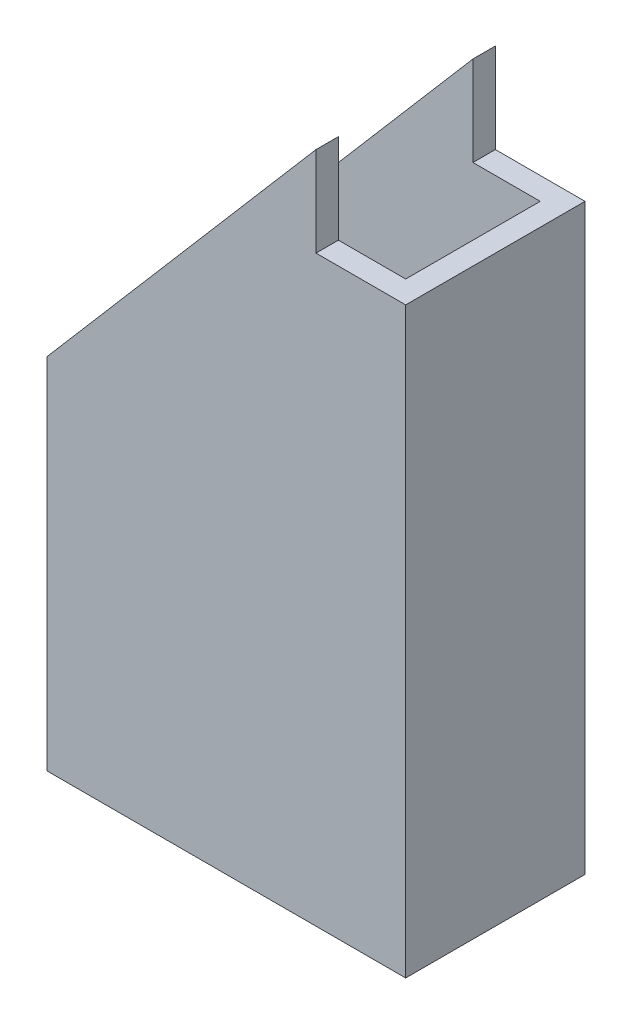
ISO-10303-21;
HEADER;
FILE_DESCRIPTION(('STEP AP214'),'2;1');
FILE_NAME('part.step','',(''),(''),'','','');
FILE_SCHEMA(('AUTOMOTIVE_DESIGN { 1 0 10303 214 1 1 1 1 }'));
ENDSEC;
DATA;
#1=APPLICATION_CONTEXT('core data for automotive mechanical design processes');
#2=APPLICATION_PROTOCOL_DEFINITION('international standard','automotive_design',2000,#1);
#3=PRODUCT_CONTEXT('',#1,'mechanical');
#4=PRODUCT('Part','Part','',(#3));
#5=PRODUCT_RELATED_PRODUCT_CATEGORY('part','',(#4));
#6=PRODUCT_DEFINITION_FORMATION('','',#4);
#7=PRODUCT_DEFINITION_CONTEXT('part definition',#1,'design');
#8=PRODUCT_DEFINITION('design','',#6,#7);
#9=PRODUCT_DEFINITION_SHAPE('','',#8);
#10=(LENGTH_UNIT() NAMED_UNIT(*) SI_UNIT(.MILLI.,.METRE.));
#11=(NAMED_UNIT(*) PLANE_ANGLE_UNIT() SI_UNIT($,.RADIAN.));
#12=(NAMED_UNIT(*) SI_UNIT($,.STERADIAN.) SOLID_ANGLE_UNIT());
#13=UNCERTAINTY_MEASURE_WITH_UNIT(LENGTH_MEASURE(1.E-05),#10,'distance_accuracy_value','');
#14=(GEOMETRIC_REPRESENTATION_CONTEXT(3) GLOBAL_UNCERTAINTY_ASSIGNED_CONTEXT((#13)) GLOBAL_UNIT_ASSIGNED_CONTEXT((#10,
#11,#12)) REPRESENTATION_CONTEXT('',''));
#15=CARTESIAN_POINT('',(0.,0.,0.));
#16=DIRECTION('',(0.,0.,1.));
#17=DIRECTION('',(1.,0.,0.));
#18=AXIS2_PLACEMENT_3D('',#15,#16,#17);
#19=CARTESIAN_POINT('',(12.7,47.625,12.7));
#20=DIRECTION('',(-1.,0.,0.));
#21=DIRECTION('',(0.,-1.,0.));
#22=AXIS2_PLACEMENT_3D('',#19,#20,#21);
#23=PLANE('',#22);
#24=DIRECTION('',(0.,0.,-1.));
#25=VECTOR('',#24,1.);
#26=CARTESIAN_POINT('',(12.7,34.925,12.7));
#27=LINE('',#26,#25);
#28=CARTESIAN_POINT('',(12.7,34.925,12.7));
#29=VERTEX_POINT('',#28);
#30=CARTESIAN_POINT('',(12.7,34.925,9.525));
#31=VERTEX_POINT('',#30);
#32=EDGE_CURVE('E196',#29,#31,#27,.T.);
#33=ORIENTED_EDGE('',*,*,#32,.T.);
#34=DIRECTION('',(0.,1.,0.));
#35=VECTOR('',#34,1.);
#36=CARTESIAN_POINT('',(12.7,47.625,9.525));
#37=LINE('',#36,#35);
#38=CARTESIAN_POINT('',(12.7,47.625,9.525));
#39=VERTEX_POINT('',#38);
#40=EDGE_CURVE('E154',#31,#39,#37,.T.);
#41=ORIENTED_EDGE('',*,*,#40,.T.);
#42=DIRECTION('',(0.,0.,-1.));
#43=VECTOR('',#42,1.);
#44=CARTESIAN_POINT('',(12.7,47.625,12.7));
#45=LINE('',#44,#43);
#46=CARTESIAN_POINT('',(12.7,47.625,12.7));
#47=VERTEX_POINT('',#46);
#48=EDGE_CURVE('E192',#47,#39,#45,.T.);
#49=ORIENTED_EDGE('',*,*,#48,.F.);
#50=DIRECTION('',(0.,1.,0.));
#51=VECTOR('',#50,1.);
#52=CARTESIAN_POINT('',(12.7,47.625,12.7));
#53=LINE('',#52,#51);
#54=EDGE_CURVE('E171',#29,#47,#53,.T.);
#55=ORIENTED_EDGE('',*,*,#54,.F.);
#56=EDGE_LOOP('',(#33,#41,#49,#55));
#57=FACE_BOUND('',#56,.T.);
#58=ADVANCED_FACE('F33',(#57),#23,.F.);
#59=CARTESIAN_POINT('',(-25.4,-47.625,12.7));
#60=DIRECTION('',(1.,0.,0.));
#61=DIRECTION('',(0.,0.,-1.));
#62=AXIS2_PLACEMENT_3D('',#59,#60,#61);
#63=PLANE('',#62);
#64=DIRECTION('',(0.,-1.,0.));
#65=VECTOR('',#64,1.);
#66=CARTESIAN_POINT('',(-25.4,-47.625,-12.7));
#67=LINE('',#66,#65);
#68=CARTESIAN_POINT('',(-25.4,3.17499999999999,-12.7));
#69=VERTEX_POINT('',#68);
#70=CARTESIAN_POINT('',(-25.4,-47.625,-12.7));
#71=VERTEX_POINT('',#70);
#72=EDGE_CURVE('E160',#69,#71,#67,.T.);
#73=ORIENTED_EDGE('',*,*,#72,.T.);
#74=DIRECTION('',(0.,0.,-1.));
#75=VECTOR('',#74,1.);
#76=CARTESIAN_POINT('',(-25.4,-47.625,12.7));
#77=LINE('',#76,#75);
#78=CARTESIAN_POINT('',(-25.4,-47.625,12.7));
#79=VERTEX_POINT('',#78);
#80=EDGE_CURVE('E205',#79,#71,#77,.T.);
#81=ORIENTED_EDGE('',*,*,#80,.F.);
#82=DIRECTION('',(0.,-1.,0.));
#83=VECTOR('',#82,1.);
#84=CARTESIAN_POINT('',(-25.4,-47.625,12.7));
#85=LINE('',#84,#83);
#86=CARTESIAN_POINT('',(-25.4,3.17499999999999,12.7));
#87=VERTEX_POINT('',#86);
#88=EDGE_CURVE('E161',#87,#79,#85,.T.);
#89=ORIENTED_EDGE('',*,*,#88,.F.);
#90=DIRECTION('',(0.,0.,-1.));
#91=VECTOR('',#90,1.);
#92=CARTESIAN_POINT('',(-25.4,3.17499999999999,12.7));
#93=LINE('',#92,#91);
#94=EDGE_CURVE('E175',#87,#69,#93,.T.);
#95=ORIENTED_EDGE('',*,*,#94,.T.);
#96=EDGE_LOOP('',(#73,#81,#89,#95));
#97=FACE_BOUND('',#96,.T.);
#98=ADVANCED_FACE('F35',(#97),#63,.F.);
#99=CARTESIAN_POINT('',(-25.4,-47.625,12.7));
#100=DIRECTION('',(0.,1.,0.));
#101=DIRECTION('',(0.,0.,1.));
#102=AXIS2_PLACEMENT_3D('',#99,#100,#101);
#103=PLANE('',#102);
#104=DIRECTION('',(1.,0.,0.));
#105=VECTOR('',#104,1.);
#106=CARTESIAN_POINT('',(-22.225,-47.625,-9.525));
#107=LINE('',#106,#105);
#108=CARTESIAN_POINT('',(-22.225,-47.625,-9.525));
#109=VERTEX_POINT('',#108);
#110=CARTESIAN_POINT('',(22.225,-47.625,-9.525));
#111=VERTEX_POINT('',#110);
#112=EDGE_CURVE('E135',#109,#111,#107,.T.);
#113=ORIENTED_EDGE('',*,*,#112,.F.);
#114=DIRECTION('',(0.,0.,-1.));
#115=VECTOR('',#114,1.);
#116=CARTESIAN_POINT('',(-22.225,-47.625,9.525));
#117=LINE('',#116,#115);
#118=CARTESIAN_POINT('',(-22.225,-47.625,9.525));
#119=VERTEX_POINT('',#118);
#120=EDGE_CURVE('E48',#119,#109,#117,.T.);
#121=ORIENTED_EDGE('',*,*,#120,.F.);
#122=DIRECTION('',(-1.,0.,0.));
#123=VECTOR('',#122,1.);
#124=CARTESIAN_POINT('',(22.225,-47.625,9.525));
#125=LINE('',#124,#123);
#126=CARTESIAN_POINT('',(22.225,-47.625,9.525));
#127=VERTEX_POINT('',#126);
#128=EDGE_CURVE('E142',#127,#119,#125,.T.);
#129=ORIENTED_EDGE('',*,*,#128,.F.);
#130=DIRECTION('',(0.,0.,1.));
#131=VECTOR('',#130,1.);
#132=CARTESIAN_POINT('',(22.225,-47.625,-9.525));
#133=LINE('',#132,#131);
#134=EDGE_CURVE('E128',#111,#127,#133,.T.);
#135=ORIENTED_EDGE('',*,*,#134,.F.);
#136=EDGE_LOOP('',(#113,#121,#129,#135));
#137=FACE_BOUND('',#136,.T.);
#138=DIRECTION('',(1.,0.,0.));
#139=VECTOR('',#138,1.);
#140=CARTESIAN_POINT('',(-25.4,-47.625,-12.7));
#141=LINE('',#140,#139);
#142=CARTESIAN_POINT('',(25.4,-47.625,-12.7));
#143=VERTEX_POINT('',#142);
#144=EDGE_CURVE('E178',#71,#143,#141,.T.);
#145=ORIENTED_EDGE('',*,*,#144,.T.);
#146=DIRECTION('',(0.,0.,-1.));
#147=VECTOR('',#146,1.);
#148=CARTESIAN_POINT('',(25.4,-47.625,12.7));
#149=LINE('',#148,#147);
#150=CARTESIAN_POINT('',(25.4,-47.625,12.7));
#151=VERTEX_POINT('',#150);
#152=EDGE_CURVE('E202',#151,#143,#149,.T.);
#153=ORIENTED_EDGE('',*,*,#152,.F.);
#154=DIRECTION('',(1.,0.,0.));
#155=VECTOR('',#154,1.);
#156=CARTESIAN_POINT('',(-25.4,-47.625,12.7));
#157=LINE('',#156,#155);
#158=EDGE_CURVE('E164',#79,#151,#157,.T.);
#159=ORIENTED_EDGE('',*,*,#158,.F.);
#160=ORIENTED_EDGE('',*,*,#80,.T.);
#161=EDGE_LOOP('',(#145,#153,#159,#160));
#162=FACE_BOUND('',#161,.T.);
#163=ADVANCED_FACE('F139',(#137,#162),#103,.F.);
#164=CARTESIAN_POINT('',(25.4,-47.625,12.7));
#165=DIRECTION('',(-1.,0.,0.));
#166=DIRECTION('',(0.,0.,1.));
#167=AXIS2_PLACEMENT_3D('',#164,#165,#166);
#168=PLANE('',#167);
#169=DIRECTION('',(0.,1.,0.));
#170=VECTOR('',#169,1.);
#171=CARTESIAN_POINT('',(25.4,-47.625,-12.7));
#172=LINE('',#171,#170);
#173=CARTESIAN_POINT('',(25.4,34.925,-12.7));
#174=VERTEX_POINT('',#173);
#175=EDGE_CURVE('E180',#143,#174,#172,.T.);
#176=ORIENTED_EDGE('',*,*,#175,.T.);
#177=DIRECTION('',(0.,0.,-1.));
#178=VECTOR('',#177,1.);
#179=CARTESIAN_POINT('',(25.4,34.925,12.7));
#180=LINE('',#179,#178);
#181=CARTESIAN_POINT('',(25.4,34.925,12.7));
#182=VERTEX_POINT('',#181);
#183=EDGE_CURVE('E199',#182,#174,#180,.T.);
#184=ORIENTED_EDGE('',*,*,#183,.F.);
#185=DIRECTION('',(0.,1.,0.));
#186=VECTOR('',#185,1.);
#187=CARTESIAN_POINT('',(25.4,-47.625,12.7));
#188=LINE('',#187,#186);
#189=EDGE_CURVE('E167',#151,#182,#188,.T.);
#190=ORIENTED_EDGE('',*,*,#189,.F.);
#191=ORIENTED_EDGE('',*,*,#152,.T.);
#192=EDGE_LOOP('',(#176,#184,#190,#191));
#193=FACE_BOUND('',#192,.T.);
#194=ADVANCED_FACE('F259',(#193),#168,.F.);
#195=CARTESIAN_POINT('',(12.7,34.925,12.7));
#196=DIRECTION('',(0.,-1.,0.));
#197=DIRECTION('',(0.,0.,-1.));
#198=AXIS2_PLACEMENT_3D('',#195,#196,#197);
#199=PLANE('',#198);
#200=DIRECTION('',(0.,0.,1.));
#201=VECTOR('',#200,1.);
#202=CARTESIAN_POINT('',(22.225,34.925,12.7));
#203=LINE('',#202,#201);
#204=CARTESIAN_POINT('',(22.225,34.925,-9.525));
#205=VERTEX_POINT('',#204);
#206=CARTESIAN_POINT('',(22.225,34.925,9.525));
#207=VERTEX_POINT('',#206);
#208=EDGE_CURVE('E11',#205,#207,#203,.T.);
#209=ORIENTED_EDGE('',*,*,#208,.T.);
#210=DIRECTION('',(-1.,0.,0.));
#211=VECTOR('',#210,1.);
#212=CARTESIAN_POINT('',(12.7,34.925,9.525));
#213=LINE('',#212,#211);
#214=EDGE_CURVE('E157',#207,#31,#213,.T.);
#215=ORIENTED_EDGE('',*,*,#214,.T.);
#216=ORIENTED_EDGE('',*,*,#32,.F.);
#217=DIRECTION('',(-1.,0.,0.));
#218=VECTOR('',#217,1.);
#219=CARTESIAN_POINT('',(12.7,34.925,12.7));
#220=LINE('',#219,#218);
#221=EDGE_CURVE('E169',#182,#29,#220,.T.);
#222=ORIENTED_EDGE('',*,*,#221,.F.);
#223=ORIENTED_EDGE('',*,*,#183,.T.);
#224=DIRECTION('',(-1.,0.,0.));
#225=VECTOR('',#224,1.);
#226=CARTESIAN_POINT('',(12.7,34.925,-12.7));
#227=LINE('',#226,#225);
#228=CARTESIAN_POINT('',(12.7,34.925,-12.7));
#229=VERTEX_POINT('',#228);
#230=EDGE_CURVE('E182',#174,#229,#227,.T.);
#231=ORIENTED_EDGE('',*,*,#230,.T.);
#232=CARTESIAN_POINT('',(12.7,34.925,-9.525));
#233=VERTEX_POINT('',#232);
#234=EDGE_CURVE('E195',#233,#229,#27,.T.);
#235=ORIENTED_EDGE('',*,*,#234,.F.);
#236=DIRECTION('',(1.,0.,0.));
#237=VECTOR('',#236,1.);
#238=CARTESIAN_POINT('',(12.7,34.925,-9.525));
#239=LINE('',#238,#237);
#240=EDGE_CURVE('E152',#233,#205,#239,.T.);
#241=ORIENTED_EDGE('',*,*,#240,.T.);
#242=EDGE_LOOP('',(#209,#215,#216,#222,#223,#231,#235,#241));
#243=FACE_BOUND('',#242,.T.);
#244=ADVANCED_FACE('F225',(#243),#199,.F.);
#245=CARTESIAN_POINT('',(12.7,47.625,-9.525));
#246=VERTEX_POINT('',#245);
#247=CARTESIAN_POINT('',(12.7,47.625,-12.7));
#248=VERTEX_POINT('',#247);
#249=EDGE_CURVE('E191',#246,#248,#45,.T.);
#250=ORIENTED_EDGE('',*,*,#249,.F.);
#251=DIRECTION('',(0.,-1.,0.));
#252=VECTOR('',#251,1.);
#253=CARTESIAN_POINT('',(12.7,47.625,-9.525));
#254=LINE('',#253,#252);
#255=EDGE_CURVE('E56',#246,#233,#254,.T.);
#256=ORIENTED_EDGE('',*,*,#255,.T.);
#257=ORIENTED_EDGE('',*,*,#234,.T.);
#258=DIRECTION('',(0.,1.,0.));
#259=VECTOR('',#258,1.);
#260=CARTESIAN_POINT('',(12.7,47.625,-12.7));
#261=LINE('',#260,#259);
#262=EDGE_CURVE('E185',#229,#248,#261,.T.);
#263=ORIENTED_EDGE('',*,*,#262,.T.);
#264=EDGE_LOOP('',(#250,#256,#257,#263));
#265=FACE_BOUND('',#264,.T.);
#266=ADVANCED_FACE('F229',(#265),#23,.F.);
#267=CARTESIAN_POINT('',(-25.4,3.17499999999999,12.7));
#268=DIRECTION('',(0.759256602365297,-0.650791373455968,0.));
#269=DIRECTION('',(0.650791373455968,0.759256602365297,0.));
#270=AXIS2_PLACEMENT_3D('',#267,#268,#269);
#271=PLANE('',#270);
#272=ORIENTED_EDGE('',*,*,#48,.T.);
#273=DIRECTION('',(-0.650791373455968,-0.759256602365297,0.));
#274=VECTOR('',#273,1.);
#275=CARTESIAN_POINT('',(-25.4,3.17499999999999,9.525));
#276=LINE('',#275,#274);
#277=CARTESIAN_POINT('',(-22.225,6.87916666666667,9.525));
#278=VERTEX_POINT('',#277);
#279=EDGE_CURVE('E41',#39,#278,#276,.T.);
#280=ORIENTED_EDGE('',*,*,#279,.T.);
#281=DIRECTION('',(0.,0.,-1.));
#282=VECTOR('',#281,1.);
#283=CARTESIAN_POINT('',(-22.225,6.87916666666666,12.7));
#284=LINE('',#283,#282);
#285=CARTESIAN_POINT('',(-22.225,6.87916666666667,-9.525));
#286=VERTEX_POINT('',#285);
#287=EDGE_CURVE('E210',#278,#286,#284,.T.);
#288=ORIENTED_EDGE('',*,*,#287,.T.);
#289=DIRECTION('',(0.650791373455968,0.759256602365297,0.));
#290=VECTOR('',#289,1.);
#291=CARTESIAN_POINT('',(-25.4,3.17499999999999,-9.525));
#292=LINE('',#291,#290);
#293=EDGE_CURVE('E208',#286,#246,#292,.T.);
#294=ORIENTED_EDGE('',*,*,#293,.T.);
#295=ORIENTED_EDGE('',*,*,#249,.T.);
#296=DIRECTION('',(-0.650791373455968,-0.759256602365297,0.));
#297=VECTOR('',#296,1.);
#298=CARTESIAN_POINT('',(-25.4,3.17499999999999,-12.7));
#299=LINE('',#298,#297);
#300=EDGE_CURVE('E165',#248,#69,#299,.T.);
#301=ORIENTED_EDGE('',*,*,#300,.T.);
#302=ORIENTED_EDGE('',*,*,#94,.F.);
#303=DIRECTION('',(-0.650791373455968,-0.759256602365297,0.));
#304=VECTOR('',#303,1.);
#305=CARTESIAN_POINT('',(-25.4,3.17499999999999,12.7));
#306=LINE('',#305,#304);
#307=EDGE_CURVE('E173',#47,#87,#306,.T.);
#308=ORIENTED_EDGE('',*,*,#307,.F.);
#309=EDGE_LOOP('',(#272,#280,#288,#294,#295,#301,#302,#308));
#310=FACE_BOUND('',#309,.T.);
#311=ADVANCED_FACE('F214',(#310),#271,.F.);
#312=CARTESIAN_POINT('',(0.,0.,12.7));
#313=DIRECTION('',(0.,0.,-1.));
#314=DIRECTION('',(-1.,0.,0.));
#315=AXIS2_PLACEMENT_3D('',#312,#313,#314);
#316=PLANE('',#315);
#317=ORIENTED_EDGE('',*,*,#88,.T.);
#318=ORIENTED_EDGE('',*,*,#158,.T.);
#319=ORIENTED_EDGE('',*,*,#189,.T.);
#320=ORIENTED_EDGE('',*,*,#221,.T.);
#321=ORIENTED_EDGE('',*,*,#54,.T.);
#322=ORIENTED_EDGE('',*,*,#307,.T.);
#323=EDGE_LOOP('',(#317,#318,#319,#320,#321,#322));
#324=FACE_BOUND('',#323,.T.);
#325=ADVANCED_FACE('F258',(#324),#316,.F.);
#326=CARTESIAN_POINT('',(0.,0.,-12.7));
#327=DIRECTION('',(0.,0.,-1.));
#328=DIRECTION('',(-1.,0.,0.));
#329=AXIS2_PLACEMENT_3D('',#326,#327,#328);
#330=PLANE('',#329);
#331=ORIENTED_EDGE('',*,*,#72,.F.);
#332=ORIENTED_EDGE('',*,*,#300,.F.);
#333=ORIENTED_EDGE('',*,*,#262,.F.);
#334=ORIENTED_EDGE('',*,*,#230,.F.);
#335=ORIENTED_EDGE('',*,*,#175,.F.);
#336=ORIENTED_EDGE('',*,*,#144,.F.);
#337=EDGE_LOOP('',(#331,#332,#333,#334,#335,#336));
#338=FACE_BOUND('',#337,.T.);
#339=ADVANCED_FACE('F241',(#338),#330,.T.);
#340=CARTESIAN_POINT('',(22.225,47.625,-9.525));
#341=DIRECTION('',(1.,0.,0.));
#342=DIRECTION('',(0.,0.,-1.));
#343=AXIS2_PLACEMENT_3D('',#340,#341,#342);
#344=PLANE('',#343);
#345=DIRECTION('',(0.,-1.,0.));
#346=VECTOR('',#345,1.);
#347=CARTESIAN_POINT('',(22.225,47.625,-9.525));
#348=LINE('',#347,#346);
#349=EDGE_CURVE('E123',#205,#111,#348,.T.);
#350=ORIENTED_EDGE('',*,*,#349,.T.);
#351=ORIENTED_EDGE('',*,*,#134,.T.);
#352=DIRECTION('',(0.,-1.,0.));
#353=VECTOR('',#352,1.);
#354=CARTESIAN_POINT('',(22.225,47.625,9.525));
#355=LINE('',#354,#353);
#356=EDGE_CURVE('E131',#207,#127,#355,.T.);
#357=ORIENTED_EDGE('',*,*,#356,.F.);
#358=ORIENTED_EDGE('',*,*,#208,.F.);
#359=EDGE_LOOP('',(#350,#351,#357,#358));
#360=FACE_BOUND('',#359,.T.);
#361=ADVANCED_FACE('F125',(#360),#344,.F.);
#362=CARTESIAN_POINT('',(-22.225,47.625,9.525));
#363=DIRECTION('',(-1.,0.,0.));
#364=DIRECTION('',(0.,0.,1.));
#365=AXIS2_PLACEMENT_3D('',#362,#363,#364);
#366=PLANE('',#365);
#367=DIRECTION('',(0.,-1.,0.));
#368=VECTOR('',#367,1.);
#369=CARTESIAN_POINT('',(-22.225,47.625,9.525));
#370=LINE('',#369,#368);
#371=EDGE_CURVE('E147',#278,#119,#370,.T.);
#372=ORIENTED_EDGE('',*,*,#371,.T.);
#373=ORIENTED_EDGE('',*,*,#120,.T.);
#374=DIRECTION('',(0.,-1.,0.));
#375=VECTOR('',#374,1.);
#376=CARTESIAN_POINT('',(-22.225,47.625,-9.525));
#377=LINE('',#376,#375);
#378=EDGE_CURVE('E132',#286,#109,#377,.T.);
#379=ORIENTED_EDGE('',*,*,#378,.F.);
#380=ORIENTED_EDGE('',*,*,#287,.F.);
#381=EDGE_LOOP('',(#372,#373,#379,#380));
#382=FACE_BOUND('',#381,.T.);
#383=ADVANCED_FACE('F233',(#382),#366,.F.);
#384=CARTESIAN_POINT('',(22.225,47.625,9.525));
#385=DIRECTION('',(0.,0.,1.));
#386=DIRECTION('',(1.,0.,0.));
#387=AXIS2_PLACEMENT_3D('',#384,#385,#386);
#388=PLANE('',#387);
#389=ORIENTED_EDGE('',*,*,#356,.T.);
#390=ORIENTED_EDGE('',*,*,#128,.T.);
#391=ORIENTED_EDGE('',*,*,#371,.F.);
#392=ORIENTED_EDGE('',*,*,#279,.F.);
#393=ORIENTED_EDGE('',*,*,#40,.F.);
#394=ORIENTED_EDGE('',*,*,#214,.F.);
#395=EDGE_LOOP('',(#389,#390,#391,#392,#393,#394));
#396=FACE_BOUND('',#395,.T.);
#397=ADVANCED_FACE('F219',(#396),#388,.F.);
#398=CARTESIAN_POINT('',(-22.225,47.625,-9.525));
#399=DIRECTION('',(0.,0.,-1.));
#400=DIRECTION('',(-1.,0.,0.));
#401=AXIS2_PLACEMENT_3D('',#398,#399,#400);
#402=PLANE('',#401);
#403=ORIENTED_EDGE('',*,*,#255,.F.);
#404=ORIENTED_EDGE('',*,*,#293,.F.);
#405=ORIENTED_EDGE('',*,*,#378,.T.);
#406=ORIENTED_EDGE('',*,*,#112,.T.);
#407=ORIENTED_EDGE('',*,*,#349,.F.);
#408=ORIENTED_EDGE('',*,*,#240,.F.);
#409=EDGE_LOOP('',(#403,#404,#405,#406,#407,#408));
#410=FACE_BOUND('',#409,.T.);
#411=ADVANCED_FACE('F136',(#410),#402,.F.);
#412=CLOSED_SHELL('',(#58,#98,#163,#194,#244,#266,#311,#325,#339,#361,#383,#397,#411));
#413=MANIFOLD_SOLID_BREP('B2',#412);
#414=ADVANCED_BREP_SHAPE_REPRESENTATION('',(#18,#413),#14);
#415=SHAPE_DEFINITION_REPRESENTATION(#9,#414);
ENDSEC;
END-ISO-10303-21;
